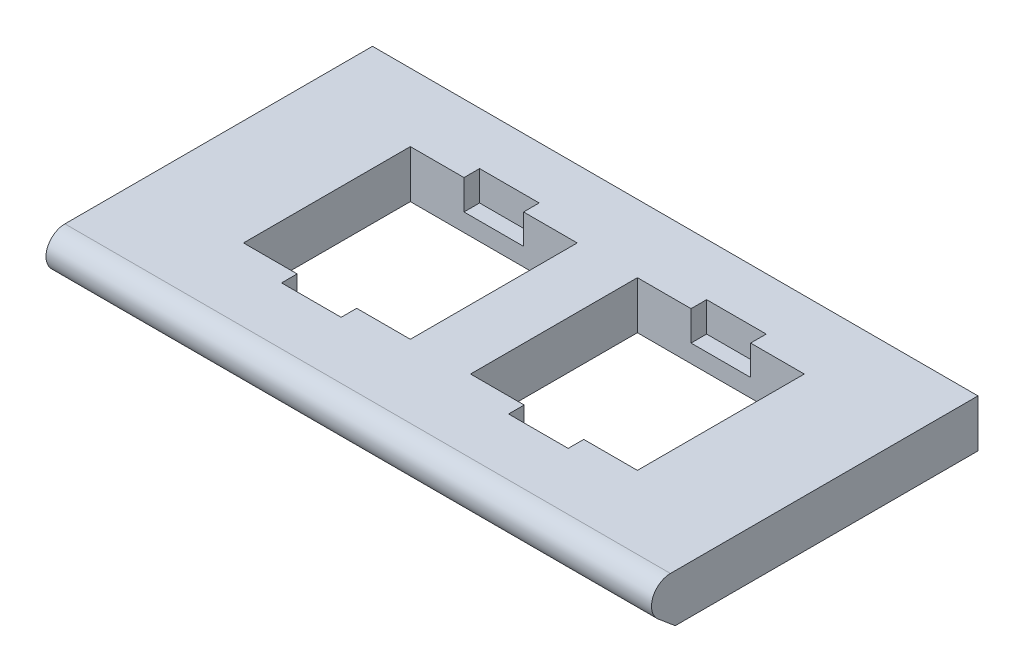
ISO-10303-21;
HEADER;
FILE_DESCRIPTION(('STEP AP214'),'2;1');
FILE_NAME('part.step','',(''),(''),'','','');
FILE_SCHEMA(('AUTOMOTIVE_DESIGN { 1 0 10303 214 1 1 1 1 }'));
ENDSEC;
DATA;
#1=APPLICATION_CONTEXT('core data for automotive mechanical design processes');
#2=APPLICATION_PROTOCOL_DEFINITION('international standard','automotive_design',2000,#1);
#3=PRODUCT_CONTEXT('',#1,'mechanical');
#4=PRODUCT('Part','Part','',(#3));
#5=PRODUCT_RELATED_PRODUCT_CATEGORY('part','',(#4));
#6=PRODUCT_DEFINITION_FORMATION('','',#4);
#7=PRODUCT_DEFINITION_CONTEXT('part definition',#1,'design');
#8=PRODUCT_DEFINITION('design','',#6,#7);
#9=PRODUCT_DEFINITION_SHAPE('','',#8);
#10=(LENGTH_UNIT() NAMED_UNIT(*) SI_UNIT(.MILLI.,.METRE.));
#11=(NAMED_UNIT(*) PLANE_ANGLE_UNIT() SI_UNIT($,.RADIAN.));
#12=(NAMED_UNIT(*) SI_UNIT($,.STERADIAN.) SOLID_ANGLE_UNIT());
#13=UNCERTAINTY_MEASURE_WITH_UNIT(LENGTH_MEASURE(1.E-05),#10,'distance_accuracy_value','');
#14=(GEOMETRIC_REPRESENTATION_CONTEXT(3) GLOBAL_UNCERTAINTY_ASSIGNED_CONTEXT((#13)) GLOBAL_UNIT_ASSIGNED_CONTEXT((#10,
#11,#12)) REPRESENTATION_CONTEXT('',''));
#15=CARTESIAN_POINT('',(0.,0.,0.));
#16=DIRECTION('',(0.,0.,1.));
#17=DIRECTION('',(1.,0.,0.));
#18=AXIS2_PLACEMENT_3D('',#15,#16,#17);
#19=CARTESIAN_POINT('',(0.,3.999992,0.));
#20=DIRECTION('',(1.,0.,0.));
#21=DIRECTION('',(0.,0.,-1.));
#22=AXIS2_PLACEMENT_3D('',#19,#20,#21);
#23=PLANE('',#22);
#24=DIRECTION('',(0.,0.642787609686541,0.766044443118977));
#25=VECTOR('',#24,1.);
#26=CARTESIAN_POINT('',(0.,0.,0.));
#27=LINE('',#26,#25);
#28=CARTESIAN_POINT('',(0.,0.,0.));
#29=VERTEX_POINT('',#28);
#30=CARTESIAN_POINT('',(0.,1.19639644654862,1.42580976334126));
#31=VERTEX_POINT('',#30);
#32=EDGE_CURVE('E229',#29,#31,#27,.T.);
#33=ORIENTED_EDGE('',*,*,#32,.T.);
#34=CARTESIAN_POINT('',(0.,2.412492,0.40538443296388));
#35=DIRECTION('',(1.,0.,0.));
#36=DIRECTION('',(0.,0.,-1.));
#37=AXIS2_PLACEMENT_3D('',#34,#35,#36);
#38=CIRCLE('',#37,1.5875);
#39=CARTESIAN_POINT('',(0.,3.999992,0.40538443296388));
#40=VERTEX_POINT('',#39);
#41=EDGE_CURVE('E59',#31,#40,#38,.F.);
#42=ORIENTED_EDGE('',*,*,#41,.T.);
#43=DIRECTION('',(0.,0.,1.));
#44=VECTOR('',#43,1.);
#45=CARTESIAN_POINT('',(0.,3.999992,0.));
#46=LINE('',#45,#44);
#47=CARTESIAN_POINT('',(0.,3.999992,-25.4));
#48=VERTEX_POINT('',#47);
#49=EDGE_CURVE('E439',#48,#40,#46,.T.);
#50=ORIENTED_EDGE('',*,*,#49,.F.);
#51=DIRECTION('',(0.,-1.,0.));
#52=VECTOR('',#51,1.);
#53=CARTESIAN_POINT('',(0.,3.999992,-25.4));
#54=LINE('',#53,#52);
#55=CARTESIAN_POINT('',(0.,0.,-25.4));
#56=VERTEX_POINT('',#55);
#57=EDGE_CURVE('E231',#48,#56,#54,.T.);
#58=ORIENTED_EDGE('',*,*,#57,.T.);
#59=DIRECTION('',(0.,0.,1.));
#60=VECTOR('',#59,1.);
#61=CARTESIAN_POINT('',(0.,0.,0.));
#62=LINE('',#61,#60);
#63=EDGE_CURVE('E226',#56,#29,#62,.T.);
#64=ORIENTED_EDGE('',*,*,#63,.T.);
#65=EDGE_LOOP('',(#33,#42,#50,#58,#64));
#66=FACE_BOUND('',#65,.T.);
#67=ADVANCED_FACE('F37',(#66),#23,.F.);
#68=CARTESIAN_POINT('',(50.8,3.999992,0.));
#69=DIRECTION('',(-1.,0.,0.));
#70=DIRECTION('',(0.,0.,1.));
#71=AXIS2_PLACEMENT_3D('',#68,#69,#70);
#72=PLANE('',#71);
#73=DIRECTION('',(0.,0.,-1.));
#74=VECTOR('',#73,1.);
#75=CARTESIAN_POINT('',(50.8,3.999992,0.));
#76=LINE('',#75,#74);
#77=CARTESIAN_POINT('',(50.8,3.999992,0.40538443296388));
#78=VERTEX_POINT('',#77);
#79=CARTESIAN_POINT('',(50.8,3.999992,-25.4));
#80=VERTEX_POINT('',#79);
#81=EDGE_CURVE('E441',#78,#80,#76,.T.);
#82=ORIENTED_EDGE('',*,*,#81,.F.);
#83=CARTESIAN_POINT('',(50.8,2.412492,0.40538443296388));
#84=DIRECTION('',(-1.,0.,0.));
#85=DIRECTION('',(0.,0.,1.));
#86=AXIS2_PLACEMENT_3D('',#83,#84,#85);
#87=CIRCLE('',#86,1.5875);
#88=CARTESIAN_POINT('',(50.8,1.19639644654862,1.42580976334126));
#89=VERTEX_POINT('',#88);
#90=EDGE_CURVE('E11',#78,#89,#87,.F.);
#91=ORIENTED_EDGE('',*,*,#90,.T.);
#92=DIRECTION('',(0.,-0.642787609686541,-0.766044443118977));
#93=VECTOR('',#92,1.);
#94=CARTESIAN_POINT('',(50.8,0.,0.));
#95=LINE('',#94,#93);
#96=CARTESIAN_POINT('',(50.8,0.,0.));
#97=VERTEX_POINT('',#96);
#98=EDGE_CURVE('E248',#89,#97,#95,.T.);
#99=ORIENTED_EDGE('',*,*,#98,.T.);
#100=DIRECTION('',(0.,0.,-1.));
#101=VECTOR('',#100,1.);
#102=CARTESIAN_POINT('',(50.8,0.,0.));
#103=LINE('',#102,#101);
#104=CARTESIAN_POINT('',(50.8,0.,-25.4));
#105=VERTEX_POINT('',#104);
#106=EDGE_CURVE('E240',#97,#105,#103,.T.);
#107=ORIENTED_EDGE('',*,*,#106,.T.);
#108=DIRECTION('',(0.,-1.,0.));
#109=VECTOR('',#108,1.);
#110=CARTESIAN_POINT('',(50.8,3.999992,-25.4));
#111=LINE('',#110,#109);
#112=EDGE_CURVE('E449',#80,#105,#111,.T.);
#113=ORIENTED_EDGE('',*,*,#112,.F.);
#114=EDGE_LOOP('',(#82,#91,#99,#107,#113));
#115=FACE_BOUND('',#114,.T.);
#116=ADVANCED_FACE('F458',(#115),#72,.F.);
#117=CARTESIAN_POINT('',(0.,3.999992,-25.4));
#118=DIRECTION('',(0.,0.,1.));
#119=DIRECTION('',(1.,0.,0.));
#120=AXIS2_PLACEMENT_3D('',#117,#118,#119);
#121=PLANE('',#120);
#122=DIRECTION('',(-1.,0.,0.));
#123=VECTOR('',#122,1.);
#124=CARTESIAN_POINT('',(0.,0.,-25.4));
#125=LINE('',#124,#123);
#126=EDGE_CURVE('E442',#105,#56,#125,.T.);
#127=ORIENTED_EDGE('',*,*,#126,.T.);
#128=ORIENTED_EDGE('',*,*,#57,.F.);
#129=DIRECTION('',(-1.,0.,0.));
#130=VECTOR('',#129,1.);
#131=CARTESIAN_POINT('',(0.,3.999992,-25.4));
#132=LINE('',#131,#130);
#133=EDGE_CURVE('E444',#80,#48,#132,.T.);
#134=ORIENTED_EDGE('',*,*,#133,.F.);
#135=ORIENTED_EDGE('',*,*,#112,.T.);
#136=EDGE_LOOP('',(#127,#128,#134,#135));
#137=FACE_BOUND('',#136,.T.);
#138=ADVANCED_FACE('F456',(#137),#121,.F.);
#139=CARTESIAN_POINT('',(0.,3.999992,0.));
#140=DIRECTION('',(0.,-1.,0.));
#141=DIRECTION('',(0.,0.,-1.));
#142=AXIS2_PLACEMENT_3D('',#139,#140,#141);
#143=PLANE('',#142);
#144=DIRECTION('',(1.,0.,0.));
#145=VECTOR('',#144,1.);
#146=CARTESIAN_POINT('',(13.376021,3.999992,-4.39293));
#147=LINE('',#146,#145);
#148=CARTESIAN_POINT('',(13.376021,3.999992,-4.39293));
#149=VERTEX_POINT('',#148);
#150=CARTESIAN_POINT('',(18.374995,3.999992,-4.39293));
#151=VERTEX_POINT('',#150);
#152=EDGE_CURVE('E322',#149,#151,#147,.T.);
#153=ORIENTED_EDGE('',*,*,#152,.F.);
#154=DIRECTION('',(0.,0.,1.));
#155=VECTOR('',#154,1.);
#156=CARTESIAN_POINT('',(13.376021,3.999992,-5.700014));
#157=LINE('',#156,#155);
#158=CARTESIAN_POINT('',(13.376021,3.999992,-5.700014));
#159=VERTEX_POINT('',#158);
#160=EDGE_CURVE('E293',#159,#149,#157,.T.);
#161=ORIENTED_EDGE('',*,*,#160,.F.);
#162=DIRECTION('',(-1.,0.,0.));
#163=VECTOR('',#162,1.);
#164=CARTESIAN_POINT('',(0.,3.999992,-5.700014));
#165=LINE('',#164,#163);
#166=CARTESIAN_POINT('',(8.875522,3.999992,-5.700014));
#167=VERTEX_POINT('',#166);
#168=EDGE_CURVE('E426',#159,#167,#165,.T.);
#169=ORIENTED_EDGE('',*,*,#168,.T.);
#170=DIRECTION('',(0.,0.,-1.));
#171=VECTOR('',#170,1.);
#172=CARTESIAN_POINT('',(8.875522,3.999992,0.));
#173=LINE('',#172,#171);
#174=CARTESIAN_POINT('',(8.875522,3.999992,-19.699986));
#175=VERTEX_POINT('',#174);
#176=EDGE_CURVE('E235',#167,#175,#173,.T.);
#177=ORIENTED_EDGE('',*,*,#176,.T.);
#178=DIRECTION('',(1.,0.,0.));
#179=VECTOR('',#178,1.);
#180=CARTESIAN_POINT('',(0.,3.999992,-19.699986));
#181=LINE('',#180,#179);
#182=CARTESIAN_POINT('',(13.376021,3.999992,-19.699986));
#183=VERTEX_POINT('',#182);
#184=EDGE_CURVE('E434',#175,#183,#181,.T.);
#185=ORIENTED_EDGE('',*,*,#184,.T.);
#186=DIRECTION('',(0.,0.,1.));
#187=VECTOR('',#186,1.);
#188=CARTESIAN_POINT('',(13.376021,3.999992,-19.699986));
#189=LINE('',#188,#187);
#190=CARTESIAN_POINT('',(13.376021,3.999992,-21.00707));
#191=VERTEX_POINT('',#190);
#192=EDGE_CURVE('E273',#191,#183,#189,.T.);
#193=ORIENTED_EDGE('',*,*,#192,.F.);
#194=DIRECTION('',(-1.,0.,0.));
#195=VECTOR('',#194,1.);
#196=CARTESIAN_POINT('',(13.376021,3.999992,-21.00707));
#197=LINE('',#196,#195);
#198=CARTESIAN_POINT('',(18.374995,3.999992,-21.00707));
#199=VERTEX_POINT('',#198);
#200=EDGE_CURVE('E340',#199,#191,#197,.T.);
#201=ORIENTED_EDGE('',*,*,#200,.F.);
#202=DIRECTION('',(0.,0.,-1.));
#203=VECTOR('',#202,1.);
#204=CARTESIAN_POINT('',(18.374995,3.999992,-19.699986));
#205=LINE('',#204,#203);
#206=CARTESIAN_POINT('',(18.374995,3.999992,-19.699986));
#207=VERTEX_POINT('',#206);
#208=EDGE_CURVE('E351',#207,#199,#205,.T.);
#209=ORIENTED_EDGE('',*,*,#208,.F.);
#210=CARTESIAN_POINT('',(22.875494,3.999992,-19.699986));
#211=VERTEX_POINT('',#210);
#212=EDGE_CURVE('E433',#207,#211,#181,.T.);
#213=ORIENTED_EDGE('',*,*,#212,.T.);
#214=DIRECTION('',(0.,0.,1.));
#215=VECTOR('',#214,1.);
#216=CARTESIAN_POINT('',(22.875494,3.999992,0.));
#217=LINE('',#216,#215);
#218=CARTESIAN_POINT('',(22.875494,3.999992,-5.700014));
#219=VERTEX_POINT('',#218);
#220=EDGE_CURVE('E430',#211,#219,#217,.T.);
#221=ORIENTED_EDGE('',*,*,#220,.T.);
#222=CARTESIAN_POINT('',(18.374995,3.999992,-5.700014));
#223=VERTEX_POINT('',#222);
#224=EDGE_CURVE('E427',#219,#223,#165,.T.);
#225=ORIENTED_EDGE('',*,*,#224,.T.);
#226=DIRECTION('',(0.,0.,-1.));
#227=VECTOR('',#226,1.);
#228=CARTESIAN_POINT('',(18.374995,3.999992,-5.700014));
#229=LINE('',#228,#227);
#230=EDGE_CURVE('E320',#151,#223,#229,.T.);
#231=ORIENTED_EDGE('',*,*,#230,.F.);
#232=EDGE_LOOP('',(#153,#161,#169,#177,#185,#193,#201,#209,#213,#221,#225,#231));
#233=FACE_BOUND('',#232,.T.);
#234=DIRECTION('',(-1.,0.,0.));
#235=VECTOR('',#234,1.);
#236=CARTESIAN_POINT('',(0.,3.999992,-5.70001399999999));
#237=LINE('',#236,#235);
#238=CARTESIAN_POINT('',(41.924478,3.999992,-5.700014));
#239=VERTEX_POINT('',#238);
#240=CARTESIAN_POINT('',(37.423979,3.999992,-5.700014));
#241=VERTEX_POINT('',#240);
#242=EDGE_CURVE('E413',#239,#241,#237,.T.);
#243=ORIENTED_EDGE('',*,*,#242,.T.);
#244=DIRECTION('',(0.,0.,-1.));
#245=VECTOR('',#244,1.);
#246=CARTESIAN_POINT('',(37.423979,3.999992,-5.700014));
#247=LINE('',#246,#245);
#248=CARTESIAN_POINT('',(37.423979,3.999992,-4.39293));
#249=VERTEX_POINT('',#248);
#250=EDGE_CURVE('E294',#249,#241,#247,.T.);
#251=ORIENTED_EDGE('',*,*,#250,.F.);
#252=DIRECTION('',(1.,0.,0.));
#253=VECTOR('',#252,1.);
#254=CARTESIAN_POINT('',(37.423979,3.999992,-4.39293));
#255=LINE('',#254,#253);
#256=CARTESIAN_POINT('',(32.425005,3.999992,-4.39293));
#257=VERTEX_POINT('',#256);
#258=EDGE_CURVE('E296',#257,#249,#255,.T.);
#259=ORIENTED_EDGE('',*,*,#258,.F.);
#260=DIRECTION('',(0.,0.,1.));
#261=VECTOR('',#260,1.);
#262=CARTESIAN_POINT('',(32.425005,3.999992,-5.700014));
#263=LINE('',#262,#261);
#264=CARTESIAN_POINT('',(32.425005,3.999992,-5.700014));
#265=VERTEX_POINT('',#264);
#266=EDGE_CURVE('E263',#265,#257,#263,.T.);
#267=ORIENTED_EDGE('',*,*,#266,.F.);
#268=CARTESIAN_POINT('',(27.924506,3.999992,-5.700014));
#269=VERTEX_POINT('',#268);
#270=EDGE_CURVE('E382',#265,#269,#237,.T.);
#271=ORIENTED_EDGE('',*,*,#270,.T.);
#272=DIRECTION('',(0.,0.,-1.));
#273=VECTOR('',#272,1.);
#274=CARTESIAN_POINT('',(27.924506,3.999992,0.));
#275=LINE('',#274,#273);
#276=CARTESIAN_POINT('',(27.924506,3.999992,-19.699986));
#277=VERTEX_POINT('',#276);
#278=EDGE_CURVE('E423',#269,#277,#275,.T.);
#279=ORIENTED_EDGE('',*,*,#278,.T.);
#280=DIRECTION('',(1.,0.,0.));
#281=VECTOR('',#280,1.);
#282=CARTESIAN_POINT('',(0.,3.999992,-19.699986));
#283=LINE('',#282,#281);
#284=CARTESIAN_POINT('',(32.425005,3.999992,-19.699986));
#285=VERTEX_POINT('',#284);
#286=EDGE_CURVE('E420',#277,#285,#283,.T.);
#287=ORIENTED_EDGE('',*,*,#286,.T.);
#288=DIRECTION('',(0.,0.,1.));
#289=VECTOR('',#288,1.);
#290=CARTESIAN_POINT('',(32.425005,3.999992,-19.699986));
#291=LINE('',#290,#289);
#292=CARTESIAN_POINT('',(32.425005,3.999992,-21.00707));
#293=VERTEX_POINT('',#292);
#294=EDGE_CURVE('E264',#293,#285,#291,.T.);
#295=ORIENTED_EDGE('',*,*,#294,.F.);
#296=DIRECTION('',(-1.,0.,0.));
#297=VECTOR('',#296,1.);
#298=CARTESIAN_POINT('',(37.423979,3.999992,-21.00707));
#299=LINE('',#298,#297);
#300=CARTESIAN_POINT('',(37.423979,3.999992,-21.00707));
#301=VERTEX_POINT('',#300);
#302=EDGE_CURVE('E266',#301,#293,#299,.T.);
#303=ORIENTED_EDGE('',*,*,#302,.F.);
#304=DIRECTION('',(0.,0.,-1.));
#305=VECTOR('',#304,1.);
#306=CARTESIAN_POINT('',(37.423979,3.999992,-19.699986));
#307=LINE('',#306,#305);
#308=CARTESIAN_POINT('',(37.423979,3.999992,-19.699986));
#309=VERTEX_POINT('',#308);
#310=EDGE_CURVE('E270',#309,#301,#307,.T.);
#311=ORIENTED_EDGE('',*,*,#310,.F.);
#312=CARTESIAN_POINT('',(41.924478,3.999992,-19.699986));
#313=VERTEX_POINT('',#312);
#314=EDGE_CURVE('E419',#309,#313,#283,.T.);
#315=ORIENTED_EDGE('',*,*,#314,.T.);
#316=DIRECTION('',(0.,0.,1.));
#317=VECTOR('',#316,1.);
#318=CARTESIAN_POINT('',(41.924478,3.999992,0.));
#319=LINE('',#318,#317);
#320=EDGE_CURVE('E416',#313,#239,#319,.T.);
#321=ORIENTED_EDGE('',*,*,#320,.T.);
#322=EDGE_LOOP('',(#243,#251,#259,#267,#271,#279,#287,#295,#303,#311,#315,#321));
#323=FACE_BOUND('',#322,.T.);
#324=ORIENTED_EDGE('',*,*,#49,.T.);
#325=DIRECTION('',(-1.,0.,0.));
#326=VECTOR('',#325,1.);
#327=CARTESIAN_POINT('',(50.8,3.999992,0.40538443296388));
#328=LINE('',#327,#326);
#329=EDGE_CURVE('E45',#40,#78,#328,.F.);
#330=ORIENTED_EDGE('',*,*,#329,.T.);
#331=ORIENTED_EDGE('',*,*,#81,.T.);
#332=ORIENTED_EDGE('',*,*,#133,.T.);
#333=EDGE_LOOP('',(#324,#330,#331,#332));
#334=FACE_BOUND('',#333,.T.);
#335=ADVANCED_FACE('F475',(#233,#323,#334),#143,.F.);
#336=CARTESIAN_POINT('',(0.,0.,0.));
#337=DIRECTION('',(0.,-1.,0.));
#338=DIRECTION('',(0.,0.,-1.));
#339=AXIS2_PLACEMENT_3D('',#336,#337,#338);
#340=PLANE('',#339);
#341=DIRECTION('',(0.,0.,1.));
#342=VECTOR('',#341,1.);
#343=CARTESIAN_POINT('',(8.875522,0.,-19.699986));
#344=LINE('',#343,#342);
#345=CARTESIAN_POINT('',(8.875522,0.,-19.699986));
#346=VERTEX_POINT('',#345);
#347=CARTESIAN_POINT('',(8.875522,0.,-5.700014));
#348=VERTEX_POINT('',#347);
#349=EDGE_CURVE('E365',#346,#348,#344,.T.);
#350=ORIENTED_EDGE('',*,*,#349,.T.);
#351=DIRECTION('',(1.,0.,0.));
#352=VECTOR('',#351,1.);
#353=CARTESIAN_POINT('',(8.875522,0.,-5.700014));
#354=LINE('',#353,#352);
#355=CARTESIAN_POINT('',(22.875494,0.,-5.700014));
#356=VERTEX_POINT('',#355);
#357=EDGE_CURVE('E368',#348,#356,#354,.T.);
#358=ORIENTED_EDGE('',*,*,#357,.T.);
#359=DIRECTION('',(0.,0.,-1.));
#360=VECTOR('',#359,1.);
#361=CARTESIAN_POINT('',(22.875494,0.,-19.699986));
#362=LINE('',#361,#360);
#363=CARTESIAN_POINT('',(22.875494,0.,-19.699986));
#364=VERTEX_POINT('',#363);
#365=EDGE_CURVE('E372',#356,#364,#362,.T.);
#366=ORIENTED_EDGE('',*,*,#365,.T.);
#367=DIRECTION('',(-1.,0.,0.));
#368=VECTOR('',#367,1.);
#369=CARTESIAN_POINT('',(8.875522,0.,-19.699986));
#370=LINE('',#369,#368);
#371=EDGE_CURVE('E375',#364,#346,#370,.T.);
#372=ORIENTED_EDGE('',*,*,#371,.T.);
#373=EDGE_LOOP('',(#350,#358,#366,#372));
#374=FACE_BOUND('',#373,.T.);
#375=DIRECTION('',(0.,0.,1.));
#376=VECTOR('',#375,1.);
#377=CARTESIAN_POINT('',(27.924506,0.,-19.699986));
#378=LINE('',#377,#376);
#379=CARTESIAN_POINT('',(27.924506,0.,-19.699986));
#380=VERTEX_POINT('',#379);
#381=CARTESIAN_POINT('',(27.924506,0.,-5.700014));
#382=VERTEX_POINT('',#381);
#383=EDGE_CURVE('E369',#380,#382,#378,.T.);
#384=ORIENTED_EDGE('',*,*,#383,.T.);
#385=DIRECTION('',(1.,0.,0.));
#386=VECTOR('',#385,1.);
#387=CARTESIAN_POINT('',(27.924506,0.,-5.700014));
#388=LINE('',#387,#386);
#389=CARTESIAN_POINT('',(41.924478,0.,-5.700014));
#390=VERTEX_POINT('',#389);
#391=EDGE_CURVE('E408',#382,#390,#388,.T.);
#392=ORIENTED_EDGE('',*,*,#391,.T.);
#393=DIRECTION('',(0.,0.,-1.));
#394=VECTOR('',#393,1.);
#395=CARTESIAN_POINT('',(41.924478,0.,-19.699986));
#396=LINE('',#395,#394);
#397=CARTESIAN_POINT('',(41.924478,0.,-19.699986));
#398=VERTEX_POINT('',#397);
#399=EDGE_CURVE('E405',#390,#398,#396,.T.);
#400=ORIENTED_EDGE('',*,*,#399,.T.);
#401=DIRECTION('',(-1.,0.,0.));
#402=VECTOR('',#401,1.);
#403=CARTESIAN_POINT('',(27.924506,0.,-19.699986));
#404=LINE('',#403,#402);
#405=EDGE_CURVE('E394',#398,#380,#404,.T.);
#406=ORIENTED_EDGE('',*,*,#405,.T.);
#407=EDGE_LOOP('',(#384,#392,#400,#406));
#408=FACE_BOUND('',#407,.T.);
#409=ORIENTED_EDGE('',*,*,#63,.F.);
#410=ORIENTED_EDGE('',*,*,#126,.F.);
#411=ORIENTED_EDGE('',*,*,#106,.F.);
#412=DIRECTION('',(1.,0.,0.));
#413=VECTOR('',#412,1.);
#414=CARTESIAN_POINT('',(0.,0.,0.));
#415=LINE('',#414,#413);
#416=EDGE_CURVE('E234',#29,#97,#415,.T.);
#417=ORIENTED_EDGE('',*,*,#416,.F.);
#418=EDGE_LOOP('',(#409,#410,#411,#417));
#419=FACE_BOUND('',#418,.T.);
#420=ADVANCED_FACE('F239',(#374,#408,#419),#340,.T.);
#421=CARTESIAN_POINT('',(27.924506,0.,-19.699986));
#422=DIRECTION('',(-1.,0.,0.));
#423=DIRECTION('',(0.,0.,1.));
#424=AXIS2_PLACEMENT_3D('',#421,#422,#423);
#425=PLANE('',#424);
#426=DIRECTION('',(0.,1.,0.));
#427=VECTOR('',#426,1.);
#428=CARTESIAN_POINT('',(27.924506,0.,-5.700014));
#429=LINE('',#428,#427);
#430=EDGE_CURVE('E391',#382,#269,#429,.T.);
#431=ORIENTED_EDGE('',*,*,#430,.F.);
#432=ORIENTED_EDGE('',*,*,#383,.F.);
#433=DIRECTION('',(0.,1.,0.));
#434=VECTOR('',#433,1.);
#435=CARTESIAN_POINT('',(27.924506,0.,-19.699986));
#436=LINE('',#435,#434);
#437=EDGE_CURVE('E358',#380,#277,#436,.T.);
#438=ORIENTED_EDGE('',*,*,#437,.T.);
#439=ORIENTED_EDGE('',*,*,#278,.F.);
#440=EDGE_LOOP('',(#431,#432,#438,#439));
#441=FACE_BOUND('',#440,.T.);
#442=ADVANCED_FACE('F478',(#441),#425,.F.);
#443=CARTESIAN_POINT('',(27.924506,0.,-19.699986));
#444=DIRECTION('',(0.,0.,-1.));
#445=DIRECTION('',(-1.,0.,0.));
#446=AXIS2_PLACEMENT_3D('',#443,#444,#445);
#447=PLANE('',#446);
#448=ORIENTED_EDGE('',*,*,#314,.F.);
#449=DIRECTION('',(0.,1.,0.));
#450=VECTOR('',#449,1.);
#451=CARTESIAN_POINT('',(37.423979,1.49987,-19.699986));
#452=LINE('',#451,#450);
#453=CARTESIAN_POINT('',(37.423979,1.49987,-19.699986));
#454=VERTEX_POINT('',#453);
#455=EDGE_CURVE('E261',#454,#309,#452,.T.);
#456=ORIENTED_EDGE('',*,*,#455,.F.);
#457=DIRECTION('',(1.,0.,0.));
#458=VECTOR('',#457,1.);
#459=CARTESIAN_POINT('',(37.423979,1.49987,-19.699986));
#460=LINE('',#459,#458);
#461=CARTESIAN_POINT('',(32.425005,1.49987,-19.699986));
#462=VERTEX_POINT('',#461);
#463=EDGE_CURVE('E255',#462,#454,#460,.T.);
#464=ORIENTED_EDGE('',*,*,#463,.F.);
#465=DIRECTION('',(0.,1.,0.));
#466=VECTOR('',#465,1.);
#467=CARTESIAN_POINT('',(32.425005,1.49987,-19.699986));
#468=LINE('',#467,#466);
#469=EDGE_CURVE('E258',#462,#285,#468,.T.);
#470=ORIENTED_EDGE('',*,*,#469,.T.);
#471=ORIENTED_EDGE('',*,*,#286,.F.);
#472=ORIENTED_EDGE('',*,*,#437,.F.);
#473=ORIENTED_EDGE('',*,*,#405,.F.);
#474=DIRECTION('',(0.,1.,0.));
#475=VECTOR('',#474,1.);
#476=CARTESIAN_POINT('',(41.924478,0.,-19.699986));
#477=LINE('',#476,#475);
#478=EDGE_CURVE('E398',#398,#313,#477,.T.);
#479=ORIENTED_EDGE('',*,*,#478,.T.);
#480=EDGE_LOOP('',(#448,#456,#464,#470,#471,#472,#473,#479));
#481=FACE_BOUND('',#480,.T.);
#482=ADVANCED_FACE('F483',(#481),#447,.F.);
#483=CARTESIAN_POINT('',(41.924478,0.,-19.699986));
#484=DIRECTION('',(1.,0.,0.));
#485=DIRECTION('',(0.,0.,-1.));
#486=AXIS2_PLACEMENT_3D('',#483,#484,#485);
#487=PLANE('',#486);
#488=ORIENTED_EDGE('',*,*,#478,.F.);
#489=ORIENTED_EDGE('',*,*,#399,.F.);
#490=DIRECTION('',(0.,1.,0.));
#491=VECTOR('',#490,1.);
#492=CARTESIAN_POINT('',(41.924478,0.,-5.700014));
#493=LINE('',#492,#491);
#494=EDGE_CURVE('E395',#390,#239,#493,.T.);
#495=ORIENTED_EDGE('',*,*,#494,.T.);
#496=ORIENTED_EDGE('',*,*,#320,.F.);
#497=EDGE_LOOP('',(#488,#489,#495,#496));
#498=FACE_BOUND('',#497,.T.);
#499=ADVANCED_FACE('F486',(#498),#487,.F.);
#500=CARTESIAN_POINT('',(27.924506,0.,-5.700014));
#501=DIRECTION('',(0.,0.,1.));
#502=DIRECTION('',(1.,0.,0.));
#503=AXIS2_PLACEMENT_3D('',#500,#501,#502);
#504=PLANE('',#503);
#505=DIRECTION('',(-1.,0.,0.));
#506=VECTOR('',#505,1.);
#507=CARTESIAN_POINT('',(37.423979,1.49987,-5.700014));
#508=LINE('',#507,#506);
#509=CARTESIAN_POINT('',(37.423979,1.49987,-5.700014));
#510=VERTEX_POINT('',#509);
#511=CARTESIAN_POINT('',(32.425005,1.49987,-5.700014));
#512=VERTEX_POINT('',#511);
#513=EDGE_CURVE('E297',#510,#512,#508,.T.);
#514=ORIENTED_EDGE('',*,*,#513,.F.);
#515=DIRECTION('',(0.,1.,0.));
#516=VECTOR('',#515,1.);
#517=CARTESIAN_POINT('',(37.423979,1.49987,-5.700014));
#518=LINE('',#517,#516);
#519=EDGE_CURVE('E290',#510,#241,#518,.T.);
#520=ORIENTED_EDGE('',*,*,#519,.T.);
#521=ORIENTED_EDGE('',*,*,#242,.F.);
#522=ORIENTED_EDGE('',*,*,#494,.F.);
#523=ORIENTED_EDGE('',*,*,#391,.F.);
#524=ORIENTED_EDGE('',*,*,#430,.T.);
#525=ORIENTED_EDGE('',*,*,#270,.F.);
#526=DIRECTION('',(0.,1.,0.));
#527=VECTOR('',#526,1.);
#528=CARTESIAN_POINT('',(32.425005,1.49987,-5.700014));
#529=LINE('',#528,#527);
#530=EDGE_CURVE('E283',#512,#265,#529,.T.);
#531=ORIENTED_EDGE('',*,*,#530,.F.);
#532=EDGE_LOOP('',(#514,#520,#521,#522,#523,#524,#525,#531));
#533=FACE_BOUND('',#532,.T.);
#534=ADVANCED_FACE('F490',(#533),#504,.F.);
#535=CARTESIAN_POINT('',(8.875522,0.,-19.699986));
#536=DIRECTION('',(-1.,0.,0.));
#537=DIRECTION('',(0.,0.,1.));
#538=AXIS2_PLACEMENT_3D('',#535,#536,#537);
#539=PLANE('',#538);
#540=DIRECTION('',(0.,1.,0.));
#541=VECTOR('',#540,1.);
#542=CARTESIAN_POINT('',(8.875522,0.,-5.700014));
#543=LINE('',#542,#541);
#544=EDGE_CURVE('E378',#348,#167,#543,.T.);
#545=ORIENTED_EDGE('',*,*,#544,.F.);
#546=ORIENTED_EDGE('',*,*,#349,.F.);
#547=DIRECTION('',(0.,1.,0.));
#548=VECTOR('',#547,1.);
#549=CARTESIAN_POINT('',(8.875522,0.,-19.699986));
#550=LINE('',#549,#548);
#551=EDGE_CURVE('E379',#346,#175,#550,.T.);
#552=ORIENTED_EDGE('',*,*,#551,.T.);
#553=ORIENTED_EDGE('',*,*,#176,.F.);
#554=EDGE_LOOP('',(#545,#546,#552,#553));
#555=FACE_BOUND('',#554,.T.);
#556=ADVANCED_FACE('F494',(#555),#539,.F.);
#557=CARTESIAN_POINT('',(8.875522,0.,-19.699986));
#558=DIRECTION('',(0.,0.,-1.));
#559=DIRECTION('',(-1.,0.,0.));
#560=AXIS2_PLACEMENT_3D('',#557,#558,#559);
#561=PLANE('',#560);
#562=DIRECTION('',(1.,0.,0.));
#563=VECTOR('',#562,1.);
#564=CARTESIAN_POINT('',(13.376021,1.49987,-19.699986));
#565=LINE('',#564,#563);
#566=CARTESIAN_POINT('',(13.376021,1.49987,-19.699986));
#567=VERTEX_POINT('',#566);
#568=CARTESIAN_POINT('',(18.374995,1.49987,-19.699986));
#569=VERTEX_POINT('',#568);
#570=EDGE_CURVE('E339',#567,#569,#565,.T.);
#571=ORIENTED_EDGE('',*,*,#570,.F.);
#572=DIRECTION('',(0.,1.,0.));
#573=VECTOR('',#572,1.);
#574=CARTESIAN_POINT('',(13.376021,1.49987,-19.699986));
#575=LINE('',#574,#573);
#576=EDGE_CURVE('E349',#567,#183,#575,.T.);
#577=ORIENTED_EDGE('',*,*,#576,.T.);
#578=ORIENTED_EDGE('',*,*,#184,.F.);
#579=ORIENTED_EDGE('',*,*,#551,.F.);
#580=ORIENTED_EDGE('',*,*,#371,.F.);
#581=DIRECTION('',(0.,1.,0.));
#582=VECTOR('',#581,1.);
#583=CARTESIAN_POINT('',(22.875494,0.,-19.699986));
#584=LINE('',#583,#582);
#585=EDGE_CURVE('E383',#364,#211,#584,.T.);
#586=ORIENTED_EDGE('',*,*,#585,.T.);
#587=ORIENTED_EDGE('',*,*,#212,.F.);
#588=DIRECTION('',(0.,1.,0.));
#589=VECTOR('',#588,1.);
#590=CARTESIAN_POINT('',(18.374995,1.49987,-19.699986));
#591=LINE('',#590,#589);
#592=EDGE_CURVE('E361',#569,#207,#591,.T.);
#593=ORIENTED_EDGE('',*,*,#592,.F.);
#594=EDGE_LOOP('',(#571,#577,#578,#579,#580,#586,#587,#593));
#595=FACE_BOUND('',#594,.T.);
#596=ADVANCED_FACE('F501',(#595),#561,.F.);
#597=CARTESIAN_POINT('',(22.875494,0.,-19.699986));
#598=DIRECTION('',(1.,0.,0.));
#599=DIRECTION('',(0.,0.,-1.));
#600=AXIS2_PLACEMENT_3D('',#597,#598,#599);
#601=PLANE('',#600);
#602=ORIENTED_EDGE('',*,*,#585,.F.);
#603=ORIENTED_EDGE('',*,*,#365,.F.);
#604=DIRECTION('',(0.,1.,0.));
#605=VECTOR('',#604,1.);
#606=CARTESIAN_POINT('',(22.875494,0.,-5.700014));
#607=LINE('',#606,#605);
#608=EDGE_CURVE('E386',#356,#219,#607,.T.);
#609=ORIENTED_EDGE('',*,*,#608,.T.);
#610=ORIENTED_EDGE('',*,*,#220,.F.);
#611=EDGE_LOOP('',(#602,#603,#609,#610));
#612=FACE_BOUND('',#611,.T.);
#613=ADVANCED_FACE('F507',(#612),#601,.F.);
#614=CARTESIAN_POINT('',(8.875522,0.,-5.700014));
#615=DIRECTION('',(0.,0.,1.));
#616=DIRECTION('',(1.,0.,0.));
#617=AXIS2_PLACEMENT_3D('',#614,#615,#616);
#618=PLANE('',#617);
#619=ORIENTED_EDGE('',*,*,#168,.F.);
#620=DIRECTION('',(0.,1.,0.));
#621=VECTOR('',#620,1.);
#622=CARTESIAN_POINT('',(13.376021,1.49987,-5.700014));
#623=LINE('',#622,#621);
#624=CARTESIAN_POINT('',(13.376021,1.49987,-5.700014));
#625=VERTEX_POINT('',#624);
#626=EDGE_CURVE('E250',#625,#159,#623,.T.);
#627=ORIENTED_EDGE('',*,*,#626,.F.);
#628=DIRECTION('',(-1.,0.,0.));
#629=VECTOR('',#628,1.);
#630=CARTESIAN_POINT('',(13.376021,1.49987,-5.700014));
#631=LINE('',#630,#629);
#632=CARTESIAN_POINT('',(18.374995,1.49987,-5.700014));
#633=VERTEX_POINT('',#632);
#634=EDGE_CURVE('E313',#633,#625,#631,.T.);
#635=ORIENTED_EDGE('',*,*,#634,.F.);
#636=DIRECTION('',(0.,1.,0.));
#637=VECTOR('',#636,1.);
#638=CARTESIAN_POINT('',(18.374995,1.49987,-5.700014));
#639=LINE('',#638,#637);
#640=EDGE_CURVE('E316',#633,#223,#639,.T.);
#641=ORIENTED_EDGE('',*,*,#640,.T.);
#642=ORIENTED_EDGE('',*,*,#224,.F.);
#643=ORIENTED_EDGE('',*,*,#608,.F.);
#644=ORIENTED_EDGE('',*,*,#357,.F.);
#645=ORIENTED_EDGE('',*,*,#544,.T.);
#646=EDGE_LOOP('',(#619,#627,#635,#641,#642,#643,#644,#645));
#647=FACE_BOUND('',#646,.T.);
#648=ADVANCED_FACE('F503',(#647),#618,.F.);
#649=CARTESIAN_POINT('',(13.376021,1.49987,-5.700014));
#650=DIRECTION('',(-1.,0.,0.));
#651=DIRECTION('',(0.,0.,1.));
#652=AXIS2_PLACEMENT_3D('',#649,#650,#651);
#653=PLANE('',#652);
#654=ORIENTED_EDGE('',*,*,#160,.T.);
#655=DIRECTION('',(0.,1.,0.));
#656=VECTOR('',#655,1.);
#657=CARTESIAN_POINT('',(13.376021,1.49987,-4.39293));
#658=LINE('',#657,#656);
#659=CARTESIAN_POINT('',(13.376021,1.49987,-4.39293));
#660=VERTEX_POINT('',#659);
#661=EDGE_CURVE('E311',#660,#149,#658,.T.);
#662=ORIENTED_EDGE('',*,*,#661,.F.);
#663=DIRECTION('',(0.,0.,1.));
#664=VECTOR('',#663,1.);
#665=CARTESIAN_POINT('',(13.376021,1.49987,-5.700014));
#666=LINE('',#665,#664);
#667=EDGE_CURVE('E323',#625,#660,#666,.T.);
#668=ORIENTED_EDGE('',*,*,#667,.F.);
#669=ORIENTED_EDGE('',*,*,#626,.T.);
#670=EDGE_LOOP('',(#654,#662,#668,#669));
#671=FACE_BOUND('',#670,.T.);
#672=ADVANCED_FACE('F506',(#671),#653,.F.);
#673=CARTESIAN_POINT('',(18.374995,1.49987,-5.700014));
#674=DIRECTION('',(1.,0.,0.));
#675=DIRECTION('',(0.,0.,-1.));
#676=AXIS2_PLACEMENT_3D('',#673,#674,#675);
#677=PLANE('',#676);
#678=ORIENTED_EDGE('',*,*,#230,.T.);
#679=ORIENTED_EDGE('',*,*,#640,.F.);
#680=DIRECTION('',(0.,0.,-1.));
#681=VECTOR('',#680,1.);
#682=CARTESIAN_POINT('',(18.374995,1.49987,-5.700014));
#683=LINE('',#682,#681);
#684=CARTESIAN_POINT('',(18.374995,1.49987,-4.39293));
#685=VERTEX_POINT('',#684);
#686=EDGE_CURVE('E330',#685,#633,#683,.T.);
#687=ORIENTED_EDGE('',*,*,#686,.F.);
#688=DIRECTION('',(0.,1.,0.));
#689=VECTOR('',#688,1.);
#690=CARTESIAN_POINT('',(18.374995,1.49987,-4.39293));
#691=LINE('',#690,#689);
#692=EDGE_CURVE('E314',#685,#151,#691,.T.);
#693=ORIENTED_EDGE('',*,*,#692,.T.);
#694=EDGE_LOOP('',(#678,#679,#687,#693));
#695=FACE_BOUND('',#694,.T.);
#696=ADVANCED_FACE('F537',(#695),#677,.F.);
#697=CARTESIAN_POINT('',(13.376021,1.49987,-4.39293));
#698=DIRECTION('',(0.,0.,1.));
#699=DIRECTION('',(1.,0.,0.));
#700=AXIS2_PLACEMENT_3D('',#697,#698,#699);
#701=PLANE('',#700);
#702=ORIENTED_EDGE('',*,*,#152,.T.);
#703=ORIENTED_EDGE('',*,*,#692,.F.);
#704=DIRECTION('',(1.,0.,0.));
#705=VECTOR('',#704,1.);
#706=CARTESIAN_POINT('',(13.376021,1.49987,-4.39293));
#707=LINE('',#706,#705);
#708=EDGE_CURVE('E332',#660,#685,#707,.T.);
#709=ORIENTED_EDGE('',*,*,#708,.F.);
#710=ORIENTED_EDGE('',*,*,#661,.T.);
#711=EDGE_LOOP('',(#702,#703,#709,#710));
#712=FACE_BOUND('',#711,.T.);
#713=ADVANCED_FACE('F535',(#712),#701,.F.);
#714=CARTESIAN_POINT('',(0.,1.49987,0.));
#715=DIRECTION('',(0.,1.,0.));
#716=DIRECTION('',(0.,0.,1.));
#717=AXIS2_PLACEMENT_3D('',#714,#715,#716);
#718=PLANE('',#717);
#719=ORIENTED_EDGE('',*,*,#667,.T.);
#720=ORIENTED_EDGE('',*,*,#708,.T.);
#721=ORIENTED_EDGE('',*,*,#686,.T.);
#722=ORIENTED_EDGE('',*,*,#634,.T.);
#723=EDGE_LOOP('',(#719,#720,#721,#722));
#724=FACE_BOUND('',#723,.T.);
#725=ADVANCED_FACE('F519',(#724),#718,.T.);
#726=CARTESIAN_POINT('',(13.376021,1.49987,-19.699986));
#727=DIRECTION('',(-1.,0.,0.));
#728=DIRECTION('',(0.,0.,1.));
#729=AXIS2_PLACEMENT_3D('',#726,#727,#728);
#730=PLANE('',#729);
#731=ORIENTED_EDGE('',*,*,#192,.T.);
#732=ORIENTED_EDGE('',*,*,#576,.F.);
#733=DIRECTION('',(0.,0.,1.));
#734=VECTOR('',#733,1.);
#735=CARTESIAN_POINT('',(13.376021,1.49987,-19.699986));
#736=LINE('',#735,#734);
#737=CARTESIAN_POINT('',(13.376021,1.49987,-21.00707));
#738=VERTEX_POINT('',#737);
#739=EDGE_CURVE('E337',#738,#567,#736,.T.);
#740=ORIENTED_EDGE('',*,*,#739,.F.);
#741=DIRECTION('',(0.,1.,0.));
#742=VECTOR('',#741,1.);
#743=CARTESIAN_POINT('',(13.376021,1.49987,-21.00707));
#744=LINE('',#743,#742);
#745=EDGE_CURVE('E356',#738,#191,#744,.T.);
#746=ORIENTED_EDGE('',*,*,#745,.T.);
#747=EDGE_LOOP('',(#731,#732,#740,#746));
#748=FACE_BOUND('',#747,.T.);
#749=ADVANCED_FACE('F515',(#748),#730,.F.);
#750=CARTESIAN_POINT('',(13.376021,1.49987,-21.00707));
#751=DIRECTION('',(0.,0.,-1.));
#752=DIRECTION('',(-1.,0.,0.));
#753=AXIS2_PLACEMENT_3D('',#750,#751,#752);
#754=PLANE('',#753);
#755=ORIENTED_EDGE('',*,*,#200,.T.);
#756=ORIENTED_EDGE('',*,*,#745,.F.);
#757=DIRECTION('',(-1.,0.,0.));
#758=VECTOR('',#757,1.);
#759=CARTESIAN_POINT('',(13.376021,1.49987,-21.00707));
#760=LINE('',#759,#758);
#761=CARTESIAN_POINT('',(18.374995,1.49987,-21.00707));
#762=VERTEX_POINT('',#761);
#763=EDGE_CURVE('E346',#762,#738,#760,.T.);
#764=ORIENTED_EDGE('',*,*,#763,.F.);
#765=DIRECTION('',(0.,1.,0.));
#766=VECTOR('',#765,1.);
#767=CARTESIAN_POINT('',(18.374995,1.49987,-21.00707));
#768=LINE('',#767,#766);
#769=EDGE_CURVE('E359',#762,#199,#768,.T.);
#770=ORIENTED_EDGE('',*,*,#769,.T.);
#771=EDGE_LOOP('',(#755,#756,#764,#770));
#772=FACE_BOUND('',#771,.T.);
#773=ADVANCED_FACE('F518',(#772),#754,.F.);
#774=CARTESIAN_POINT('',(18.374995,1.49987,-19.699986));
#775=DIRECTION('',(1.,0.,0.));
#776=DIRECTION('',(0.,0.,-1.));
#777=AXIS2_PLACEMENT_3D('',#774,#775,#776);
#778=PLANE('',#777);
#779=ORIENTED_EDGE('',*,*,#208,.T.);
#780=ORIENTED_EDGE('',*,*,#769,.F.);
#781=DIRECTION('',(0.,0.,-1.));
#782=VECTOR('',#781,1.);
#783=CARTESIAN_POINT('',(18.374995,1.49987,-19.699986));
#784=LINE('',#783,#782);
#785=EDGE_CURVE('E343',#569,#762,#784,.T.);
#786=ORIENTED_EDGE('',*,*,#785,.F.);
#787=ORIENTED_EDGE('',*,*,#592,.T.);
#788=EDGE_LOOP('',(#779,#780,#786,#787));
#789=FACE_BOUND('',#788,.T.);
#790=ADVANCED_FACE('F521',(#789),#778,.F.);
#791=CARTESIAN_POINT('',(0.,1.49987,0.));
#792=DIRECTION('',(0.,-1.,0.));
#793=DIRECTION('',(0.,0.,-1.));
#794=AXIS2_PLACEMENT_3D('',#791,#792,#793);
#795=PLANE('',#794);
#796=ORIENTED_EDGE('',*,*,#739,.T.);
#797=ORIENTED_EDGE('',*,*,#570,.T.);
#798=ORIENTED_EDGE('',*,*,#785,.T.);
#799=ORIENTED_EDGE('',*,*,#763,.T.);
#800=EDGE_LOOP('',(#796,#797,#798,#799));
#801=FACE_BOUND('',#800,.T.);
#802=ADVANCED_FACE('F524',(#801),#795,.F.);
#803=CARTESIAN_POINT('',(37.423979,1.49987,-5.700014));
#804=DIRECTION('',(1.,0.,0.));
#805=DIRECTION('',(0.,0.,-1.));
#806=AXIS2_PLACEMENT_3D('',#803,#804,#805);
#807=PLANE('',#806);
#808=ORIENTED_EDGE('',*,*,#250,.T.);
#809=ORIENTED_EDGE('',*,*,#519,.F.);
#810=DIRECTION('',(0.,0.,-1.));
#811=VECTOR('',#810,1.);
#812=CARTESIAN_POINT('',(37.423979,1.49987,-5.700014));
#813=LINE('',#812,#811);
#814=CARTESIAN_POINT('',(37.423979,1.49987,-4.39293));
#815=VERTEX_POINT('',#814);
#816=EDGE_CURVE('E285',#815,#510,#813,.T.);
#817=ORIENTED_EDGE('',*,*,#816,.F.);
#818=DIRECTION('',(0.,1.,0.));
#819=VECTOR('',#818,1.);
#820=CARTESIAN_POINT('',(37.423979,1.49987,-4.39293));
#821=LINE('',#820,#819);
#822=EDGE_CURVE('E288',#815,#249,#821,.T.);
#823=ORIENTED_EDGE('',*,*,#822,.T.);
#824=EDGE_LOOP('',(#808,#809,#817,#823));
#825=FACE_BOUND('',#824,.T.);
#826=ADVANCED_FACE('F531',(#825),#807,.F.);
#827=CARTESIAN_POINT('',(37.423979,1.49987,-4.39293));
#828=DIRECTION('',(0.,0.,1.));
#829=DIRECTION('',(1.,0.,0.));
#830=AXIS2_PLACEMENT_3D('',#827,#828,#829);
#831=PLANE('',#830);
#832=ORIENTED_EDGE('',*,*,#258,.T.);
#833=ORIENTED_EDGE('',*,*,#822,.F.);
#834=DIRECTION('',(1.,0.,0.));
#835=VECTOR('',#834,1.);
#836=CARTESIAN_POINT('',(37.423979,1.49987,-4.39293));
#837=LINE('',#836,#835);
#838=CARTESIAN_POINT('',(32.425005,1.49987,-4.39293));
#839=VERTEX_POINT('',#838);
#840=EDGE_CURVE('E303',#839,#815,#837,.T.);
#841=ORIENTED_EDGE('',*,*,#840,.F.);
#842=DIRECTION('',(0.,1.,0.));
#843=VECTOR('',#842,1.);
#844=CARTESIAN_POINT('',(32.425005,1.49987,-4.39293));
#845=LINE('',#844,#843);
#846=EDGE_CURVE('E286',#839,#257,#845,.T.);
#847=ORIENTED_EDGE('',*,*,#846,.T.);
#848=EDGE_LOOP('',(#832,#833,#841,#847));
#849=FACE_BOUND('',#848,.T.);
#850=ADVANCED_FACE('F555',(#849),#831,.F.);
#851=CARTESIAN_POINT('',(32.425005,1.49987,-5.700014));
#852=DIRECTION('',(-1.,0.,0.));
#853=DIRECTION('',(0.,0.,1.));
#854=AXIS2_PLACEMENT_3D('',#851,#852,#853);
#855=PLANE('',#854);
#856=ORIENTED_EDGE('',*,*,#266,.T.);
#857=ORIENTED_EDGE('',*,*,#846,.F.);
#858=DIRECTION('',(0.,0.,1.));
#859=VECTOR('',#858,1.);
#860=CARTESIAN_POINT('',(32.425005,1.49987,-5.700014));
#861=LINE('',#860,#859);
#862=EDGE_CURVE('E306',#512,#839,#861,.T.);
#863=ORIENTED_EDGE('',*,*,#862,.F.);
#864=ORIENTED_EDGE('',*,*,#530,.T.);
#865=EDGE_LOOP('',(#856,#857,#863,#864));
#866=FACE_BOUND('',#865,.T.);
#867=ADVANCED_FACE('F551',(#866),#855,.F.);
#868=CARTESIAN_POINT('',(0.,1.49987,0.));
#869=DIRECTION('',(0.,1.,0.));
#870=DIRECTION('',(0.,0.,1.));
#871=AXIS2_PLACEMENT_3D('',#868,#869,#870);
#872=PLANE('',#871);
#873=ORIENTED_EDGE('',*,*,#513,.T.);
#874=ORIENTED_EDGE('',*,*,#862,.T.);
#875=ORIENTED_EDGE('',*,*,#840,.T.);
#876=ORIENTED_EDGE('',*,*,#816,.T.);
#877=EDGE_LOOP('',(#873,#874,#875,#876));
#878=FACE_BOUND('',#877,.T.);
#879=ADVANCED_FACE('F547',(#878),#872,.T.);
#880=CARTESIAN_POINT('',(37.423979,1.49987,-19.699986));
#881=DIRECTION('',(1.,0.,0.));
#882=DIRECTION('',(0.,0.,-1.));
#883=AXIS2_PLACEMENT_3D('',#880,#881,#882);
#884=PLANE('',#883);
#885=ORIENTED_EDGE('',*,*,#310,.T.);
#886=DIRECTION('',(0.,1.,0.));
#887=VECTOR('',#886,1.);
#888=CARTESIAN_POINT('',(37.423979,1.49987,-21.00707));
#889=LINE('',#888,#887);
#890=CARTESIAN_POINT('',(37.423979,1.49987,-21.00707));
#891=VERTEX_POINT('',#890);
#892=EDGE_CURVE('E253',#891,#301,#889,.T.);
#893=ORIENTED_EDGE('',*,*,#892,.F.);
#894=DIRECTION('',(0.,0.,-1.));
#895=VECTOR('',#894,1.);
#896=CARTESIAN_POINT('',(37.423979,1.49987,-19.699986));
#897=LINE('',#896,#895);
#898=EDGE_CURVE('E267',#454,#891,#897,.T.);
#899=ORIENTED_EDGE('',*,*,#898,.F.);
#900=ORIENTED_EDGE('',*,*,#455,.T.);
#901=EDGE_LOOP('',(#885,#893,#899,#900));
#902=FACE_BOUND('',#901,.T.);
#903=ADVANCED_FACE('F550',(#902),#884,.F.);
#904=CARTESIAN_POINT('',(32.425005,1.49987,-19.699986));
#905=DIRECTION('',(-1.,0.,0.));
#906=DIRECTION('',(0.,0.,1.));
#907=AXIS2_PLACEMENT_3D('',#904,#905,#906);
#908=PLANE('',#907);
#909=ORIENTED_EDGE('',*,*,#294,.T.);
#910=ORIENTED_EDGE('',*,*,#469,.F.);
#911=DIRECTION('',(0.,0.,1.));
#912=VECTOR('',#911,1.);
#913=CARTESIAN_POINT('',(32.425005,1.49987,-19.699986));
#914=LINE('',#913,#912);
#915=CARTESIAN_POINT('',(32.425005,1.49987,-21.00707));
#916=VERTEX_POINT('',#915);
#917=EDGE_CURVE('E276',#916,#462,#914,.T.);
#918=ORIENTED_EDGE('',*,*,#917,.F.);
#919=DIRECTION('',(0.,1.,0.));
#920=VECTOR('',#919,1.);
#921=CARTESIAN_POINT('',(32.425005,1.49987,-21.00707));
#922=LINE('',#921,#920);
#923=EDGE_CURVE('E256',#916,#293,#922,.T.);
#924=ORIENTED_EDGE('',*,*,#923,.T.);
#925=EDGE_LOOP('',(#909,#910,#918,#924));
#926=FACE_BOUND('',#925,.T.);
#927=ADVANCED_FACE('F567',(#926),#908,.F.);
#928=CARTESIAN_POINT('',(37.423979,1.49987,-21.00707));
#929=DIRECTION('',(0.,0.,-1.));
#930=DIRECTION('',(-1.,0.,0.));
#931=AXIS2_PLACEMENT_3D('',#928,#929,#930);
#932=PLANE('',#931);
#933=ORIENTED_EDGE('',*,*,#302,.T.);
#934=ORIENTED_EDGE('',*,*,#923,.F.);
#935=DIRECTION('',(-1.,0.,0.));
#936=VECTOR('',#935,1.);
#937=CARTESIAN_POINT('',(37.423979,1.49987,-21.00707));
#938=LINE('',#937,#936);
#939=EDGE_CURVE('E278',#891,#916,#938,.T.);
#940=ORIENTED_EDGE('',*,*,#939,.F.);
#941=ORIENTED_EDGE('',*,*,#892,.T.);
#942=EDGE_LOOP('',(#933,#934,#940,#941));
#943=FACE_BOUND('',#942,.T.);
#944=ADVANCED_FACE('F565',(#943),#932,.F.);
#945=CARTESIAN_POINT('',(0.,1.49987,0.));
#946=DIRECTION('',(0.,1.,0.));
#947=DIRECTION('',(0.,0.,1.));
#948=AXIS2_PLACEMENT_3D('',#945,#946,#947);
#949=PLANE('',#948);
#950=ORIENTED_EDGE('',*,*,#898,.T.);
#951=ORIENTED_EDGE('',*,*,#939,.T.);
#952=ORIENTED_EDGE('',*,*,#917,.T.);
#953=ORIENTED_EDGE('',*,*,#463,.T.);
#954=EDGE_LOOP('',(#950,#951,#952,#953));
#955=FACE_BOUND('',#954,.T.);
#956=ADVANCED_FACE('F465',(#955),#949,.T.);
#957=CARTESIAN_POINT('',(57.022882861651,0.,0.));
#958=DIRECTION('',(0.,-0.766044443118977,0.642787609686541));
#959=DIRECTION('',(0.,-0.642787609686541,-0.766044443118977));
#960=AXIS2_PLACEMENT_3D('',#957,#958,#959);
#961=PLANE('',#960);
#962=ORIENTED_EDGE('',*,*,#98,.F.);
#963=DIRECTION('',(-1.,0.,0.));
#964=VECTOR('',#963,1.);
#965=CARTESIAN_POINT('',(0.,1.19639644654862,1.42580976334126));
#966=LINE('',#965,#964);
#967=EDGE_CURVE('E247',#89,#31,#966,.T.);
#968=ORIENTED_EDGE('',*,*,#967,.T.);
#969=ORIENTED_EDGE('',*,*,#32,.F.);
#970=ORIENTED_EDGE('',*,*,#416,.T.);
#971=EDGE_LOOP('',(#962,#968,#969,#970));
#972=FACE_BOUND('',#971,.T.);
#973=ADVANCED_FACE('F245',(#972),#961,.T.);
#974=CARTESIAN_POINT('',(57.022882861651,2.412492,0.40538443296388));
#975=DIRECTION('',(1.,0.,0.));
#976=DIRECTION('',(0.,0.,-1.));
#977=AXIS2_PLACEMENT_3D('',#974,#975,#976);
#978=CYLINDRICAL_SURFACE('',#977,1.5875);
#979=ORIENTED_EDGE('',*,*,#90,.F.);
#980=ORIENTED_EDGE('',*,*,#329,.F.);
#981=ORIENTED_EDGE('',*,*,#41,.F.);
#982=ORIENTED_EDGE('',*,*,#967,.F.);
#983=EDGE_LOOP('',(#979,#980,#981,#982));
#984=FACE_BOUND('',#983,.T.);
#985=ADVANCED_FACE('F39',(#984),#978,.T.);
#986=CLOSED_SHELL('',(#67,#116,#138,#335,#420,#442,#482,#499,#534,#556,#596,#613,#648,#672,#696,
#713,#725,#749,#773,#790,#802,#826,#850,#867,#879,#903,#927,#944,#956,#973,#985));
#987=MANIFOLD_SOLID_BREP('B2',#986);
#988=ADVANCED_BREP_SHAPE_REPRESENTATION('',(#18,#987),#14);
#989=SHAPE_DEFINITION_REPRESENTATION(#9,#988);
ENDSEC;
END-ISO-10303-21;
